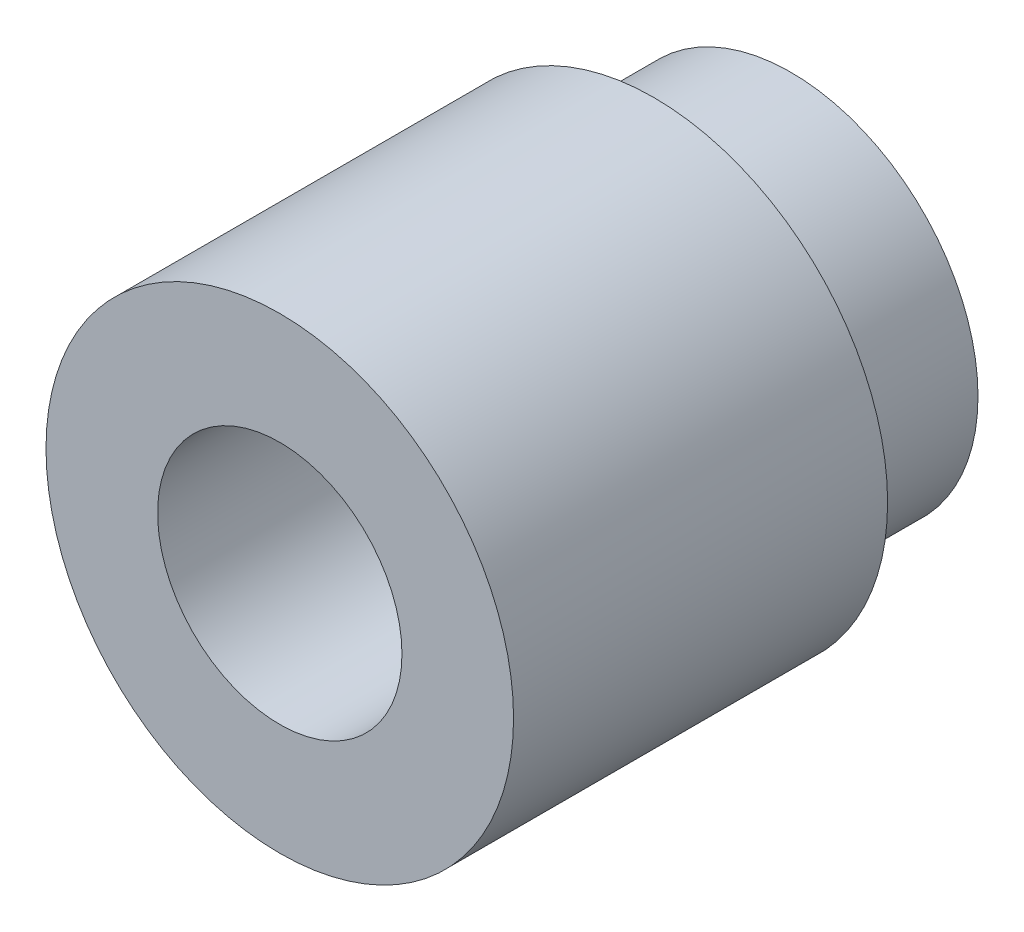
ISO-10303-21;
HEADER;
FILE_DESCRIPTION(('STEP AP214'),'2;1');
FILE_NAME('part.step','',(''),(''),'','','');
FILE_SCHEMA(('AUTOMOTIVE_DESIGN { 1 0 10303 214 1 1 1 1 }'));
ENDSEC;
DATA;
#1=APPLICATION_CONTEXT('core data for automotive mechanical design processes');
#2=APPLICATION_PROTOCOL_DEFINITION('international standard','automotive_design',2000,#1);
#3=PRODUCT_CONTEXT('',#1,'mechanical');
#4=PRODUCT('Part','Part','',(#3));
#5=PRODUCT_RELATED_PRODUCT_CATEGORY('part','',(#4));
#6=PRODUCT_DEFINITION_FORMATION('','',#4);
#7=PRODUCT_DEFINITION_CONTEXT('part definition',#1,'design');
#8=PRODUCT_DEFINITION('design','',#6,#7);
#9=PRODUCT_DEFINITION_SHAPE('','',#8);
#10=(LENGTH_UNIT() NAMED_UNIT(*) SI_UNIT(.MILLI.,.METRE.));
#11=(NAMED_UNIT(*) PLANE_ANGLE_UNIT() SI_UNIT($,.RADIAN.));
#12=(NAMED_UNIT(*) SI_UNIT($,.STERADIAN.) SOLID_ANGLE_UNIT());
#13=UNCERTAINTY_MEASURE_WITH_UNIT(LENGTH_MEASURE(1.E-05),#10,'distance_accuracy_value','');
#14=(GEOMETRIC_REPRESENTATION_CONTEXT(3) GLOBAL_UNCERTAINTY_ASSIGNED_CONTEXT((#13)) GLOBAL_UNIT_ASSIGNED_CONTEXT((#10,
#11,#12)) REPRESENTATION_CONTEXT('',''));
#15=CARTESIAN_POINT('',(0.,0.,0.));
#16=DIRECTION('',(0.,0.,1.));
#17=DIRECTION('',(1.,0.,0.));
#18=AXIS2_PLACEMENT_3D('',#15,#16,#17);
#19=CARTESIAN_POINT('',(0.,4.7625,0.));
#20=DIRECTION('',(0.,0.,-1.));
#21=DIRECTION('',(-1.,0.,0.));
#22=AXIS2_PLACEMENT_3D('',#19,#20,#21);
#23=PLANE('',#22);
#24=CARTESIAN_POINT('',(0.,0.,0.));
#25=DIRECTION('',(0.,0.,1.));
#26=DIRECTION('',(1.,0.,0.));
#27=AXIS2_PLACEMENT_3D('',#24,#25,#26);
#28=CIRCLE('',#27,2.4892);
#29=CARTESIAN_POINT('',(2.4892,0.,0.));
#30=VERTEX_POINT('',#29);
#31=EDGE_CURVE('E10',#30,#30,#28,.T.);
#32=ORIENTED_EDGE('',*,*,#31,.F.);
#33=EDGE_LOOP('',(#32));
#34=FACE_BOUND('',#33,.T.);
#35=CARTESIAN_POINT('',(0.,0.,0.));
#36=DIRECTION('',(0.,0.,1.));
#37=DIRECTION('',(1.,0.,0.));
#38=AXIS2_PLACEMENT_3D('',#35,#36,#37);
#39=CIRCLE('',#38,4.7625);
#40=CARTESIAN_POINT('',(4.7625,0.,0.));
#41=VERTEX_POINT('',#40);
#42=EDGE_CURVE('E55',#41,#41,#39,.T.);
#43=ORIENTED_EDGE('',*,*,#42,.T.);
#44=EDGE_LOOP('',(#43));
#45=FACE_BOUND('',#44,.T.);
#46=ADVANCED_FACE('F33',(#34,#45),#23,.F.);
#47=CARTESIAN_POINT('',(0.,0.,10.8778932242732));
#48=DIRECTION('',(0.,0.,1.));
#49=DIRECTION('',(1.,0.,0.));
#50=AXIS2_PLACEMENT_3D('',#47,#48,#49);
#51=CYLINDRICAL_SURFACE('',#50,2.4892);
#52=CARTESIAN_POINT('',(0.,0.,-10.414));
#53=DIRECTION('',(0.,0.,1.));
#54=DIRECTION('',(1.,0.,0.));
#55=AXIS2_PLACEMENT_3D('',#52,#53,#54);
#56=CIRCLE('',#55,2.4892);
#57=CARTESIAN_POINT('',(2.4892,0.,-10.414));
#58=VERTEX_POINT('',#57);
#59=EDGE_CURVE('E39',#58,#58,#56,.T.);
#60=ORIENTED_EDGE('',*,*,#59,.F.);
#61=EDGE_LOOP('',(#60));
#62=FACE_BOUND('',#61,.T.);
#63=ORIENTED_EDGE('',*,*,#31,.T.);
#64=EDGE_LOOP('',(#63));
#65=FACE_BOUND('',#64,.T.);
#66=ADVANCED_FACE('F80',(#62,#65),#51,.F.);
#67=CARTESIAN_POINT('',(0.,2.4892,-10.414));
#68=DIRECTION('',(0.,0.,1.));
#69=DIRECTION('',(1.,0.,0.));
#70=AXIS2_PLACEMENT_3D('',#67,#68,#69);
#71=PLANE('',#70);
#72=CARTESIAN_POINT('',(0.,0.,-10.414));
#73=DIRECTION('',(0.,0.,1.));
#74=DIRECTION('',(1.,0.,0.));
#75=AXIS2_PLACEMENT_3D('',#72,#73,#74);
#76=CIRCLE('',#75,3.81);
#77=CARTESIAN_POINT('',(3.81,0.,-10.414));
#78=VERTEX_POINT('',#77);
#79=EDGE_CURVE('E43',#78,#78,#76,.T.);
#80=ORIENTED_EDGE('',*,*,#79,.F.);
#81=EDGE_LOOP('',(#80));
#82=FACE_BOUND('',#81,.T.);
#83=ORIENTED_EDGE('',*,*,#59,.T.);
#84=EDGE_LOOP('',(#83));
#85=FACE_BOUND('',#84,.T.);
#86=ADVANCED_FACE('F75',(#82,#85),#71,.F.);
#87=CARTESIAN_POINT('',(0.,0.,10.8778932242732));
#88=DIRECTION('',(0.,0.,1.));
#89=DIRECTION('',(1.,0.,0.));
#90=AXIS2_PLACEMENT_3D('',#87,#88,#89);
#91=CYLINDRICAL_SURFACE('',#90,3.81);
#92=CARTESIAN_POINT('',(0.,0.,-7.62));
#93=DIRECTION('',(0.,0.,1.));
#94=DIRECTION('',(1.,0.,0.));
#95=AXIS2_PLACEMENT_3D('',#92,#93,#94);
#96=CIRCLE('',#95,3.81);
#97=CARTESIAN_POINT('',(3.81,0.,-7.62));
#98=VERTEX_POINT('',#97);
#99=EDGE_CURVE('E47',#98,#98,#96,.T.);
#100=ORIENTED_EDGE('',*,*,#99,.F.);
#101=EDGE_LOOP('',(#100));
#102=FACE_BOUND('',#101,.T.);
#103=ORIENTED_EDGE('',*,*,#79,.T.);
#104=EDGE_LOOP('',(#103));
#105=FACE_BOUND('',#104,.T.);
#106=ADVANCED_FACE('F69',(#102,#105),#91,.T.);
#107=CARTESIAN_POINT('',(0.,3.81,-7.62));
#108=DIRECTION('',(0.,0.,1.));
#109=DIRECTION('',(1.,0.,0.));
#110=AXIS2_PLACEMENT_3D('',#107,#108,#109);
#111=PLANE('',#110);
#112=CARTESIAN_POINT('',(0.,0.,-7.62));
#113=DIRECTION('',(0.,0.,1.));
#114=DIRECTION('',(1.,0.,0.));
#115=AXIS2_PLACEMENT_3D('',#112,#113,#114);
#116=CIRCLE('',#115,4.7625);
#117=CARTESIAN_POINT('',(4.7625,0.,-7.62));
#118=VERTEX_POINT('',#117);
#119=EDGE_CURVE('E52',#118,#118,#116,.T.);
#120=ORIENTED_EDGE('',*,*,#119,.F.);
#121=EDGE_LOOP('',(#120));
#122=FACE_BOUND('',#121,.T.);
#123=ORIENTED_EDGE('',*,*,#99,.T.);
#124=EDGE_LOOP('',(#123));
#125=FACE_BOUND('',#124,.T.);
#126=ADVANCED_FACE('F63',(#122,#125),#111,.F.);
#127=CARTESIAN_POINT('',(0.,0.,10.8778932242732));
#128=DIRECTION('',(0.,0.,1.));
#129=DIRECTION('',(1.,0.,0.));
#130=AXIS2_PLACEMENT_3D('',#127,#128,#129);
#131=CYLINDRICAL_SURFACE('',#130,4.7625);
#132=ORIENTED_EDGE('',*,*,#42,.F.);
#133=EDGE_LOOP('',(#132));
#134=FACE_BOUND('',#133,.T.);
#135=ORIENTED_EDGE('',*,*,#119,.T.);
#136=EDGE_LOOP('',(#135));
#137=FACE_BOUND('',#136,.T.);
#138=ADVANCED_FACE('F60',(#134,#137),#131,.T.);
#139=CLOSED_SHELL('',(#46,#66,#86,#106,#126,#138));
#140=MANIFOLD_SOLID_BREP('B2',#139);
#141=ADVANCED_BREP_SHAPE_REPRESENTATION('',(#18,#140),#14);
#142=SHAPE_DEFINITION_REPRESENTATION(#9,#141);
ENDSEC;
END-ISO-10303-21;
